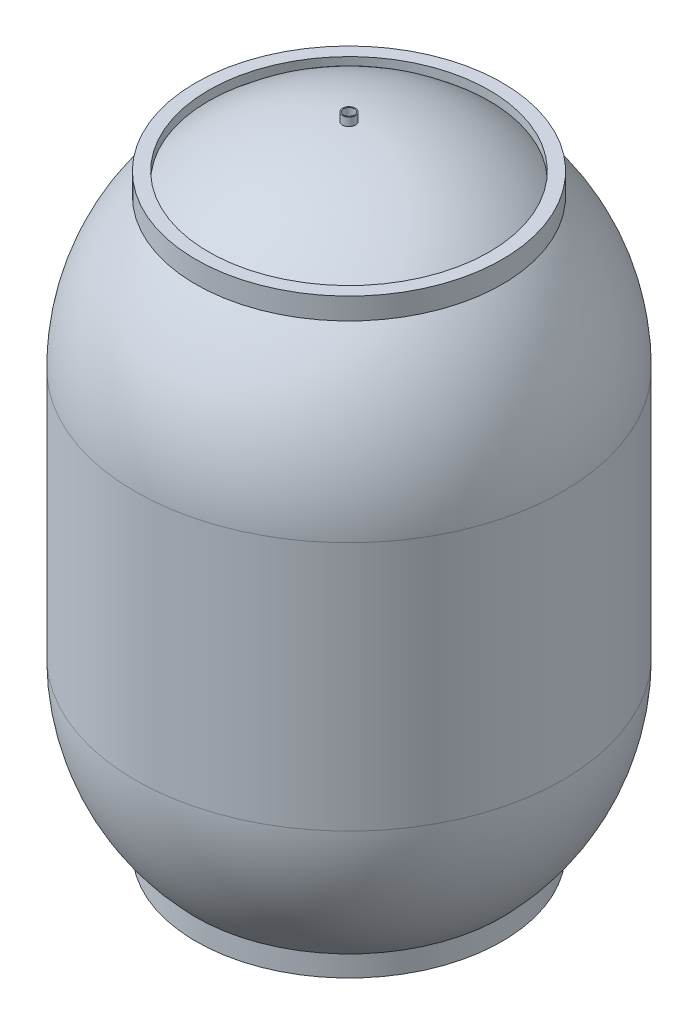
ISO-10303-21;
HEADER;
FILE_DESCRIPTION(('STEP AP214'),'2;1');
FILE_NAME('part.step','',(''),(''),'','','');
FILE_SCHEMA(('AUTOMOTIVE_DESIGN { 1 0 10303 214 1 1 1 1 }'));
ENDSEC;
DATA;
#1=APPLICATION_CONTEXT('core data for automotive mechanical design processes');
#2=APPLICATION_PROTOCOL_DEFINITION('international standard','automotive_design',2000,#1);
#3=PRODUCT_CONTEXT('',#1,'mechanical');
#4=PRODUCT('Part','Part','',(#3));
#5=PRODUCT_RELATED_PRODUCT_CATEGORY('part','',(#4));
#6=PRODUCT_DEFINITION_FORMATION('','',#4);
#7=PRODUCT_DEFINITION_CONTEXT('part definition',#1,'design');
#8=PRODUCT_DEFINITION('design','',#6,#7);
#9=PRODUCT_DEFINITION_SHAPE('','',#8);
#10=(LENGTH_UNIT() NAMED_UNIT(*) SI_UNIT(.MILLI.,.METRE.));
#11=(NAMED_UNIT(*) PLANE_ANGLE_UNIT() SI_UNIT($,.RADIAN.));
#12=(NAMED_UNIT(*) SI_UNIT($,.STERADIAN.) SOLID_ANGLE_UNIT());
#13=UNCERTAINTY_MEASURE_WITH_UNIT(LENGTH_MEASURE(1.E-05),#10,'distance_accuracy_value','');
#14=(GEOMETRIC_REPRESENTATION_CONTEXT(3) GLOBAL_UNCERTAINTY_ASSIGNED_CONTEXT((#13)) GLOBAL_UNIT_ASSIGNED_CONTEXT((#10,
#11,#12)) REPRESENTATION_CONTEXT('',''));
#15=CARTESIAN_POINT('',(0.,0.,0.));
#16=DIRECTION('',(0.,0.,1.));
#17=DIRECTION('',(1.,0.,0.));
#18=AXIS2_PLACEMENT_3D('',#15,#16,#17);
#19=CARTESIAN_POINT('',(0.,-3141.3,0.));
#20=DIRECTION('',(0.,1.,0.));
#21=DIRECTION('',(0.,0.,1.));
#22=AXIS2_PLACEMENT_3D('',#19,#20,#21);
#23=CYLINDRICAL_SURFACE('',#22,30.);
#24=CARTESIAN_POINT('',(0.,-0.45464985176169,0.));
#25=DIRECTION('',(0.,-1.,0.));
#26=DIRECTION('',(0.,0.,-1.));
#27=AXIS2_PLACEMENT_3D('',#24,#25,#26);
#28=CIRCLE('',#27,30.);
#29=CARTESIAN_POINT('',(0.,-0.45464985176169,-30.));
#30=VERTEX_POINT('',#29);
#31=EDGE_CURVE('E84',#30,#30,#28,.T.);
#32=ORIENTED_EDGE('',*,*,#31,.T.);
#33=EDGE_LOOP('',(#32));
#34=FACE_BOUND('',#33,.T.);
#35=CARTESIAN_POINT('',(0.,0.,0.));
#36=DIRECTION('',(0.,1.,0.));
#37=DIRECTION('',(0.,0.,1.));
#38=AXIS2_PLACEMENT_3D('',#35,#36,#37);
#39=CIRCLE('',#38,30.);
#40=CARTESIAN_POINT('',(0.,0.,30.));
#41=VERTEX_POINT('',#40);
#42=EDGE_CURVE('E10',#41,#41,#39,.F.);
#43=ORIENTED_EDGE('',*,*,#42,.F.);
#44=EDGE_LOOP('',(#43));
#45=FACE_BOUND('',#44,.T.);
#46=ADVANCED_FACE('F39',(#34,#45),#23,.F.);
#47=CARTESIAN_POINT('',(-2.17534878999004E-11,-2939.07,0.));
#48=DIRECTION('',(0.,-1.,0.));
#49=DIRECTION('',(1.,0.,0.));
#50=AXIS2_PLACEMENT_3D('',#47,#48,#49);
#51=PLANE('',#50);
#52=CARTESIAN_POINT('',(3.47179437938087E-13,-2939.07,0.));
#53=DIRECTION('',(0.,1.,0.));
#54=DIRECTION('',(-1.,0.,0.));
#55=AXIS2_PLACEMENT_3D('',#52,#53,#54);
#56=CIRCLE('',#55,649.929573971954);
#57=CARTESIAN_POINT('',(-649.929573971953,-2939.07,0.));
#58=VERTEX_POINT('',#57);
#59=EDGE_CURVE('E55',#58,#58,#56,.T.);
#60=ORIENTED_EDGE('',*,*,#59,.T.);
#61=EDGE_LOOP('',(#60));
#62=FACE_BOUND('',#61,.T.);
#63=CARTESIAN_POINT('',(3.47179437938087E-13,-2939.07,0.));
#64=DIRECTION('',(0.,1.,0.));
#65=DIRECTION('',(-1.,0.,0.));
#66=AXIS2_PLACEMENT_3D('',#63,#64,#65);
#67=CIRCLE('',#66,709.929573971954);
#68=CARTESIAN_POINT('',(-709.929573971953,-2939.07,0.));
#69=VERTEX_POINT('',#68);
#70=EDGE_CURVE('E72',#69,#69,#67,.T.);
#71=ORIENTED_EDGE('',*,*,#70,.F.);
#72=EDGE_LOOP('',(#71));
#73=FACE_BOUND('',#72,.T.);
#74=ADVANCED_FACE('F111',(#62,#73),#51,.T.);
#75=CARTESIAN_POINT('',(0.,0.,0.));
#76=DIRECTION('',(0.,1.,0.));
#77=DIRECTION('',(-1.,0.,0.));
#78=AXIS2_PLACEMENT_3D('',#75,#76,#77);
#79=CYLINDRICAL_SURFACE('',#78,649.929573971954);
#80=CARTESIAN_POINT('',(3.42423846928602E-13,-2898.81123654541,0.));
#81=DIRECTION('',(0.,1.,0.));
#82=DIRECTION('',(-1.,0.,0.));
#83=AXIS2_PLACEMENT_3D('',#80,#81,#82);
#84=CIRCLE('',#83,649.929573971954);
#85=CARTESIAN_POINT('',(649.929573971954,-2898.81123654541,0.));
#86=VERTEX_POINT('',#85);
#87=EDGE_CURVE('E50',#86,#86,#84,.T.);
#88=ORIENTED_EDGE('',*,*,#87,.T.);
#89=EDGE_LOOP('',(#88));
#90=FACE_BOUND('',#89,.T.);
#91=ORIENTED_EDGE('',*,*,#59,.F.);
#92=EDGE_LOOP('',(#91));
#93=FACE_BOUND('',#92,.T.);
#94=ADVANCED_FACE('F114',(#90,#93),#79,.F.);
#95=CARTESIAN_POINT('',(0.,0.,0.));
#96=DIRECTION('',(0.,1.,0.));
#97=DIRECTION('',(-1.,0.,0.));
#98=AXIS2_PLACEMENT_3D('',#95,#96,#97);
#99=CYLINDRICAL_SURFACE('',#98,709.929573971954);
#100=ORIENTED_EDGE('',*,*,#70,.T.);
#101=EDGE_LOOP('',(#100));
#102=FACE_BOUND('',#101,.T.);
#103=CARTESIAN_POINT('',(3.35744378948675E-13,-2842.26576809153,0.));
#104=DIRECTION('',(0.,1.,0.));
#105=DIRECTION('',(-1.,0.,0.));
#106=AXIS2_PLACEMENT_3D('',#103,#104,#105);
#107=CIRCLE('',#106,709.929573971954);
#108=CARTESIAN_POINT('',(-709.929573971953,-2842.26576809153,0.));
#109=VERTEX_POINT('',#108);
#110=EDGE_CURVE('E46',#109,#109,#107,.T.);
#111=ORIENTED_EDGE('',*,*,#110,.F.);
#112=EDGE_LOOP('',(#111));
#113=FACE_BOUND('',#112,.T.);
#114=ADVANCED_FACE('F116',(#102,#113),#99,.T.);
#115=CARTESIAN_POINT('',(2.77555756156289E-13,-2149.07,0.));
#116=DIRECTION('',(0.,1.,0.));
#117=DIRECTION('',(1.,0.,0.));
#118=AXIS2_PLACEMENT_3D('',#115,#116,#117);
#119=SPHERICAL_SURFACE('',#118,992.23);
#120=CARTESIAN_POINT('',(0.,-3140.84637242475,0.));
#121=DIRECTION('',(0.,1.,0.));
#122=DIRECTION('',(0.,0.,1.));
#123=AXIS2_PLACEMENT_3D('',#120,#121,#122);
#124=CIRCLE('',#123,30.);
#125=CARTESIAN_POINT('',(29.9999999999962,-3140.84637242475,0.));
#126=VERTEX_POINT('',#125);
#127=EDGE_CURVE('E77',#126,#126,#124,.F.);
#128=CARTESIAN_POINT('',(29.9999999999962,-3140.84637242475,0.));
#129=CARTESIAN_POINT('',(37.0660800715071,-3140.63264470113,0.));
#130=CARTESIAN_POINT('',(44.1298747069167,-3140.34337743555,0.));
#131=CARTESIAN_POINT('',(58.249668954205,-3139.61395033201,0.));
#132=CARTESIAN_POINT('',(65.3056685660836,-3139.17379049403,0.));
#133=CARTESIAN_POINT('',(79.4066486149817,-3138.14276475719,0.));
#134=CARTESIAN_POINT('',(86.4516290520012,-3137.55189885831,0.));
#135=CARTESIAN_POINT('',(100.527352587922,-3136.21973482872,0.));
#136=CARTESIAN_POINT('',(107.558095686823,-3135.47843669801,0.));
#137=CARTESIAN_POINT('',(121.602132631634,-3133.84574580677,0.));
#138=CARTESIAN_POINT('',(128.615426477545,-3132.95435304625,0.));
#139=CARTESIAN_POINT('',(142.621361041368,-3131.02188039142,0.));
#140=CARTESIAN_POINT('',(149.614001759282,-3129.98080049711,0.));
#141=CARTESIAN_POINT('',(163.575435608734,-3127.7494290971,0.));
#142=CARTESIAN_POINT('',(170.544228740273,-3126.5591375914,0.));
#143=CARTESIAN_POINT('',(184.454783857836,-3124.02988675069,0.));
#144=CARTESIAN_POINT('',(191.396545843859,-3122.69092741568,0.));
#145=CARTESIAN_POINT('',(205.249867458591,-3119.86495258898,0.));
#146=CARTESIAN_POINT('',(212.161427087301,-3118.3779370973,0.));
#147=CARTESIAN_POINT('',(225.951186573332,-3115.25652927336,0.));
#148=CARTESIAN_POINT('',(232.829386430654,-3113.6221369411,0.));
#149=CARTESIAN_POINT('',(246.549284199518,-3110.20672207658,0.));
#150=CARTESIAN_POINT('',(253.390982111059,-3108.42569954432,0.));
#151=CARTESIAN_POINT('',(267.034750489211,-3104.71783790606,0.));
#152=CARTESIAN_POINT('',(273.836820955822,-3102.79099880006,0.));
#153=CARTESIAN_POINT('',(287.398227047997,-3098.79238425397,0.));
#154=CARTESIAN_POINT('',(294.157562673562,-3096.72060881388,0.));
#155=CARTESIAN_POINT('',(307.630411210129,-3092.43306805072,0.));
#156=CARTESIAN_POINT('',(314.343924121131,-3090.21730272763,0.));
#157=CARTESIAN_POINT('',(327.72206028829,-3085.64279442859,0.));
#158=CARTESIAN_POINT('',(334.386683544446,-3083.28405145262,0.));
#159=CARTESIAN_POINT('',(347.663995795935,-3078.42466539453,0.));
#160=CARTESIAN_POINT('',(354.276684791267,-3075.9240223124,0.));
#161=CARTESIAN_POINT('',(367.447107640305,-3070.78197841308,0.));
#162=CARTESIAN_POINT('',(374.004841494012,-3068.14057759587,0.));
#163=CARTESIAN_POINT('',(387.062358284206,-3062.71822489996,0.));
#164=CARTESIAN_POINT('',(393.562141220693,-3059.93727302124,0.));
#165=CARTESIAN_POINT('',(406.500786874624,-3054.23708862711,0.));
#166=CARTESIAN_POINT('',(412.939649592069,-3051.3178561117,0.));
#167=CARTESIAN_POINT('',(425.753513336334,-3045.34244403984,0.));
#168=CARTESIAN_POINT('',(432.128514363154,-3042.28626448339,0.));
#169=CARTESIAN_POINT('',(444.811742428577,-3036.0383544868,0.));
#170=CARTESIAN_POINT('',(451.11996946718,-3032.84662404665,0.));
#171=CARTESIAN_POINT('',(463.66676776302,-3026.32907036381,0.));
#172=CARTESIAN_POINT('',(469.905339020258,-3023.00324712113,0.));
#173=CARTESIAN_POINT('',(482.309975781051,-3016.21902717204,0.));
#174=CARTESIAN_POINT('',(488.476041284606,-3012.76063046563,0.));
#175=CARTESIAN_POINT('',(500.732849688901,-3005.71284349195,0.));
#176=CARTESIAN_POINT('',(506.82359258964,-3002.12345322468,0.));
#177=CARTESIAN_POINT('',(518.926973347693,-2994.81531887261,0.));
#178=CARTESIAN_POINT('',(524.939611205006,-2991.09657478781,0.));
#179=CARTESIAN_POINT('',(536.884035120766,-2983.53143164213,0.));
#180=CARTESIAN_POINT('',(542.815821179214,-2979.68503258125,0.));
#181=CARTESIAN_POINT('',(554.595831661087,-2971.86633662193,0.));
#182=CARTESIAN_POINT('',(560.444056084513,-2967.89403972348,0.));
#183=CARTESIAN_POINT('',(572.054271694624,-2959.82536281493,0.));
#184=CARTESIAN_POINT('',(577.816262881308,-2955.72898280483,0.));
#185=CARTESIAN_POINT('',(589.251379582961,-2947.4140108101,0.));
#186=CARTESIAN_POINT('',(594.92450509793,-2943.19541882547,0.));
#187=CARTESIAN_POINT('',(606.179299465911,-2934.63795087077,0.));
#188=CARTESIAN_POINT('',(611.760968318924,-2930.29907490069,0.));
#189=CARTESIAN_POINT('',(622.830296987663,-2921.50301810045,0.));
#190=CARTESIAN_POINT('',(628.317956803389,-2917.0458372703,0.));
#191=CARTESIAN_POINT('',(639.196769781596,-2908.01521815142,0.));
#192=CARTESIAN_POINT('',(644.587922944076,-2903.44177986269,0.));
#193=CARTESIAN_POINT('',(649.929573971954,-2898.81123654541,0.));
#194=B_SPLINE_CURVE_WITH_KNOTS('',3,(#128,#129,#130,#131,#132,#133,#134,#135,#136,#137,#138,
#139,#140,#141,#142,#143,#144,#145,#146,#147,#148,#149,#150,#151,#152,#153,#154,#155,#156,#157,
#158,#159,#160,#161,#162,#163,#164,#165,#166,#167,#168,#169,#170,#171,#172,#173,#174,#175,#176,
#177,#178,#179,#180,#181,#182,#183,#184,#185,#186,#187,#188,#189,#190,#191,#192,#193),
.UNSPECIFIED.,.F.,.F.,(4,2,2,2,2,2,2,2,2,2,2,2,2,2,2,2,2,2,2,2,2,2,2,2,2,2,2,2,2,2,2,2,4),(0.,
21.2075304631037,42.4150609262073,63.622591389311,84.8301218524147,106.037652315518,
127.245182778622,148.452713241725,169.660243704829,190.867774167933,212.075304631036,
233.28283509414,254.490365557244,275.697896020347,296.905426483451,318.112956946555,
339.320487409658,360.528017872762,381.735548335866,402.943078798969,424.150609262073,
445.358139725177,466.56567018828,487.773200651384,508.980731114488,530.188261577591,
551.395792040695,572.603322503799,593.810852966902,615.018383430006,636.225913893109,
657.433444356213,678.640974819317),.UNSPECIFIED.);
#195=EDGE_CURVE('BSEAM123',#126,#86,#194,.T.);
#196=ORIENTED_EDGE('',*,*,#127,.F.);
#197=ORIENTED_EDGE('',*,*,#87,.F.);
#198=ORIENTED_EDGE('',*,*,#195,.T.);
#199=ORIENTED_EDGE('',*,*,#195,.F.);
#200=EDGE_LOOP('',(#196,#198,#197,#199));
#201=FACE_BOUND('',#200,.T.);
#202=ADVANCED_FACE('F123',(#201),#119,.T.);
#203=CARTESIAN_POINT('',(1.21430643318376E-13,-990.,0.));
#204=DIRECTION('',(0.,1.,0.));
#205=DIRECTION('',(-1.,0.,0.));
#206=AXIS2_PLACEMENT_3D('',#203,#204,#205);
#207=SPHERICAL_SURFACE('',#206,992.23);
#208=CARTESIAN_POINT('',(0.,1.77637242475159,0.));
#209=DIRECTION('',(0.,-1.,0.));
#210=DIRECTION('',(0.,0.,-1.));
#211=AXIS2_PLACEMENT_3D('',#208,#209,#210);
#212=CIRCLE('',#211,30.);
#213=CARTESIAN_POINT('',(-30.0000000000028,1.7763724247517,0.));
#214=VERTEX_POINT('',#213);
#215=EDGE_CURVE('E91',#214,#214,#212,.F.);
#216=CARTESIAN_POINT('',(0.,-241.07615309421,0.));
#217=DIRECTION('',(0.,1.,0.));
#218=DIRECTION('',(-1.,0.,0.));
#219=AXIS2_PLACEMENT_3D('',#216,#217,#218);
#220=CIRCLE('',#219,650.871296368056);
#221=CARTESIAN_POINT('',(-650.871296368055,-241.07615309421,0.));
#222=VERTEX_POINT('',#221);
#223=EDGE_CURVE('E69',#222,#222,#220,.T.);
#224=CARTESIAN_POINT('',(-30.0000000000028,1.7763724247517,0.));
#225=CARTESIAN_POINT('',(-37.0790635464691,1.562252058539,0.));
#226=CARTESIAN_POINT('',(-44.155833245174,1.2723142074529,0.));
#227=CARTESIAN_POINT('',(-58.3015430002631,0.540991241095167,0.));
#228=CARTESIAN_POINT('',(-65.3704830566473,0.0996061258235217,0.));
#229=CARTESIAN_POINT('',(-79.4972915802972,-0.934423663344088,0.));
#230=CARTESIAN_POINT('',(-86.5551600475629,-1.52706833724005,0.));
#231=CARTESIAN_POINT('',(-100.656589484557,-2.86334157743072,0.));
#232=CARTESIAN_POINT('',(-107.700150454286,-3.60697014372544,0.));
#233=CARTESIAN_POINT('',(-121.769735290187,-5.24487126027031,0.));
#234=CARTESIAN_POINT('',(-128.79575915636,-6.13914381052047,0.));
#235=CARTESIAN_POINT('',(-142.82704828915,-8.07792257869581,0.));
#236=CARTESIAN_POINT('',(-149.832313555768,-9.122428796621,0.));
#237=CARTESIAN_POINT('',(-163.818873492998,-11.3611960579966,0.));
#238=CARTESIAN_POINT('',(-170.800168163609,-12.5554571014471,0.));
#239=CARTESIAN_POINT('',(-184.735585908117,-15.0931864115477,0.));
#240=CARTESIAN_POINT('',(-191.689708982014,-16.436654678198,0.));
#241=CARTESIAN_POINT('',(-205.567594989537,-19.27218244489,0.));
#242=CARTESIAN_POINT('',(-212.491357923164,-20.7642419449317,0.));
#243=CARTESIAN_POINT('',(-226.305349027412,-23.8962680509684,0.));
#244=CARTESIAN_POINT('',(-233.195577198034,-25.5362346569633,0.));
#245=CARTESIAN_POINT('',(-246.939339529508,-28.9633230322498,0.));
#246=CARTESIAN_POINT('',(-253.792873690359,-30.7504448015412,0.));
#247=CARTESIAN_POINT('',(-267.460105580164,-34.4710240879797,0.));
#248=CARTESIAN_POINT('',(-274.273803309118,-36.4044816051267,0.));
#249=CARTESIAN_POINT('',(-287.858238178445,-40.4168458753894,0.));
#250=CARTESIAN_POINT('',(-294.628975318819,-42.4957526285051,0.));
#251=CARTESIAN_POINT('',(-308.124384552214,-46.79806216868,0.));
#252=CARTESIAN_POINT('',(-314.849056645237,-49.0214649557392,0.));
#253=CARTESIAN_POINT('',(-328.249252446499,-53.6117471087361,0.));
#254=CARTESIAN_POINT('',(-334.92477615474,-55.9786264746739,0.));
#255=CARTESIAN_POINT('',(-348.223614384091,-60.8547765447433,0.));
#256=CARTESIAN_POINT('',(-354.846928905203,-63.364047248875,0.));
#257=CARTESIAN_POINT('',(-368.038311896447,-68.5238294666255,0.));
#258=CARTESIAN_POINT('',(-374.60638036658,-71.1743409802443,0.));
#259=CARTESIAN_POINT('',(-387.68425972295,-76.6153895277699,0.));
#260=CARTESIAN_POINT('',(-394.194070609187,-79.4059265616768,0.));
#261=CARTESIAN_POINT('',(-407.152449976603,-85.1257466573113,0.));
#262=CARTESIAN_POINT('',(-413.601018457782,-88.0550297190389,0.));
#263=CARTESIAN_POINT('',(-426.433956274248,-94.0509987612392,0.));
#264=CARTESIAN_POINT('',(-432.818325609535,-97.1176847417119,0.));
#265=CARTESIAN_POINT('',(-445.519937829406,-103.387053511557,0.));
#266=CARTESIAN_POINT('',(-451.837180713989,-106.58973630093,0.));
#267=CARTESIAN_POINT('',(-464.401643505892,-113.129630222644,0.));
#268=CARTESIAN_POINT('',(-470.648863413211,-116.466841354985,0.));
#269=CARTESIAN_POINT('',(-483.07041583026,-123.274261814054,0.));
#270=CARTESIAN_POINT('',(-489.244748339989,-126.744471140783,0.));
#271=CARTESIAN_POINT('',(-501.517694961534,-133.816296858506,0.));
#272=CARTESIAN_POINT('',(-507.616309073351,-137.4179132495,0.));
#273=CARTESIAN_POINT('',(-519.735022615302,-144.750901715442,0.));
#274=CARTESIAN_POINT('',(-525.755122045436,-148.482273790389,0.));
#275=CARTESIAN_POINT('',(-537.714045944521,-156.073062744192,0.));
#276=CARTESIAN_POINT('',(-543.652870413472,-159.932479623048,0.));
#277=CARTESIAN_POINT('',(-555.446521359712,-167.777588614425,0.));
#278=CARTESIAN_POINT('',(-561.301347837,-171.763280726947,0.));
#279=CARTESIAN_POINT('',(-572.924318344883,-179.859112642986,0.));
#280=CARTESIAN_POINT('',(-578.692462375479,-183.969252446504,0.));
#281=CARTESIAN_POINT('',(-590.139423050552,-192.312095416711,0.));
#282=CARTESIAN_POINT('',(-595.818239695029,-196.544798583401,0.));
#283=CARTESIAN_POINT('',(-607.083942471691,-205.130826727245,0.));
#284=CARTESIAN_POINT('',(-612.670828603877,-209.484151704398,0.));
#285=CARTESIAN_POINT('',(-623.750106187632,-218.309430447354,0.));
#286=CARTESIAN_POINT('',(-629.242497639201,-222.781384213155,0.));
#287=CARTESIAN_POINT('',(-640.130276937907,-231.841858797801,0.));
#288=CARTESIAN_POINT('',(-645.525664785044,-236.430379616646,0.));
#289=CARTESIAN_POINT('',(-650.871296368055,-241.07615309421,0.));
#290=B_SPLINE_CURVE_WITH_KNOTS('',3,(#224,#225,#226,#227,#228,#229,#230,#231,#232,#233,#234,
#235,#236,#237,#238,#239,#240,#241,#242,#243,#244,#245,#246,#247,#248,#249,#250,#251,#252,#253,
#254,#255,#256,#257,#258,#259,#260,#261,#262,#263,#264,#265,#266,#267,#268,#269,#270,#271,#272,
#273,#274,#275,#276,#277,#278,#279,#280,#281,#282,#283,#284,#285,#286,#287,#288,#289),
.UNSPECIFIED.,.F.,.F.,(4,2,2,2,2,2,2,2,2,2,2,2,2,2,2,2,2,2,2,2,2,2,2,2,2,2,2,2,2,2,2,2,4),(0.,
21.2464964586853,42.4929929173708,63.7394893760561,84.9859858347416,106.232482293427,
127.478978752112,148.725475210798,169.971971669483,191.218468128169,212.464964586854,
233.711461045539,254.957957504225,276.20445396291,297.450950421596,318.697446880281,
339.943943338966,361.190439797652,382.436936256337,403.683432715022,424.929929173708,
446.176425632393,467.422922091079,488.669418549764,509.915915008449,531.162411467135,
552.40890792582,573.655404384506,594.901900843191,616.148397301876,637.394893760562,
658.641390219247,679.887886677933),.UNSPECIFIED.);
#291=EDGE_CURVE('BSEAM170',#214,#222,#290,.T.);
#292=ORIENTED_EDGE('',*,*,#215,.F.);
#293=ORIENTED_EDGE('',*,*,#223,.T.);
#294=ORIENTED_EDGE('',*,*,#291,.T.);
#295=ORIENTED_EDGE('',*,*,#291,.F.);
#296=EDGE_LOOP('',(#292,#294,#293,#295));
#297=FACE_BOUND('',#296,.T.);
#298=ADVANCED_FACE('F170',(#297),#207,.T.);
#299=CARTESIAN_POINT('',(0.,0.,0.));
#300=DIRECTION('',(0.,1.,0.));
#301=DIRECTION('',(-1.,0.,0.));
#302=AXIS2_PLACEMENT_3D('',#299,#300,#301);
#303=CYLINDRICAL_SURFACE('',#302,650.871296368056);
#304=ORIENTED_EDGE('',*,*,#223,.F.);
#305=EDGE_LOOP('',(#304));
#306=FACE_BOUND('',#305,.T.);
#307=CARTESIAN_POINT('',(0.,-197.77,0.));
#308=DIRECTION('',(0.,1.,0.));
#309=DIRECTION('',(-1.,0.,0.));
#310=AXIS2_PLACEMENT_3D('',#307,#308,#309);
#311=CIRCLE('',#310,650.871296368056);
#312=CARTESIAN_POINT('',(-650.871296368056,-197.77,0.));
#313=VERTEX_POINT('',#312);
#314=EDGE_CURVE('E59',#313,#313,#311,.T.);
#315=ORIENTED_EDGE('',*,*,#314,.T.);
#316=EDGE_LOOP('',(#315));
#317=FACE_BOUND('',#316,.T.);
#318=ADVANCED_FACE('F177',(#306,#317),#303,.F.);
#319=CARTESIAN_POINT('',(0.,-197.77,0.));
#320=DIRECTION('',(0.,-1.,0.));
#321=DIRECTION('',(1.,0.,0.));
#322=AXIS2_PLACEMENT_3D('',#319,#320,#321);
#323=PLANE('',#322);
#324=ORIENTED_EDGE('',*,*,#314,.F.);
#325=EDGE_LOOP('',(#324));
#326=FACE_BOUND('',#325,.T.);
#327=CARTESIAN_POINT('',(0.,-197.77,0.));
#328=DIRECTION('',(0.,1.,0.));
#329=DIRECTION('',(-1.,0.,0.));
#330=AXIS2_PLACEMENT_3D('',#327,#328,#329);
#331=CIRCLE('',#330,710.871296368056);
#332=CARTESIAN_POINT('',(-710.871296368056,-197.77,0.));
#333=VERTEX_POINT('',#332);
#334=EDGE_CURVE('E62',#333,#333,#331,.T.);
#335=ORIENTED_EDGE('',*,*,#334,.T.);
#336=EDGE_LOOP('',(#335));
#337=FACE_BOUND('',#336,.T.);
#338=ADVANCED_FACE('F145',(#326,#337),#323,.F.);
#339=CARTESIAN_POINT('',(0.,0.,0.));
#340=DIRECTION('',(0.,1.,0.));
#341=DIRECTION('',(-1.,0.,0.));
#342=AXIS2_PLACEMENT_3D('',#339,#340,#341);
#343=CYLINDRICAL_SURFACE('',#342,710.871296368056);
#344=ORIENTED_EDGE('',*,*,#334,.F.);
#345=EDGE_LOOP('',(#344));
#346=FACE_BOUND('',#345,.T.);
#347=CARTESIAN_POINT('',(0.,-297.77,0.));
#348=DIRECTION('',(0.,1.,0.));
#349=DIRECTION('',(-1.,0.,0.));
#350=AXIS2_PLACEMENT_3D('',#347,#348,#349);
#351=CIRCLE('',#350,710.871296368056);
#352=CARTESIAN_POINT('',(-710.871296368056,-297.77,0.));
#353=VERTEX_POINT('',#352);
#354=EDGE_CURVE('E66',#353,#353,#351,.T.);
#355=ORIENTED_EDGE('',*,*,#354,.T.);
#356=EDGE_LOOP('',(#355));
#357=FACE_BOUND('',#356,.T.);
#358=ADVANCED_FACE('F234',(#346,#357),#343,.T.);
#359=CARTESIAN_POINT('',(1.1694435435655E-13,-990.,0.));
#360=DIRECTION('',(0.,1.,0.));
#361=DIRECTION('',(-1.,0.,0.));
#362=AXIS2_PLACEMENT_3D('',#359,#360,#361);
#363=CIRCLE('',#362,992.23);
#364=CARTESIAN_POINT('',(-992.23,-990.,0.));
#365=VERTEX_POINT('',#364);
#366=EDGE_CURVE('E73',#365,#365,#363,.T.);
#367=ORIENTED_EDGE('',*,*,#366,.T.);
#368=EDGE_LOOP('',(#367));
#369=FACE_BOUND('',#368,.T.);
#370=ORIENTED_EDGE('',*,*,#354,.F.);
#371=EDGE_LOOP('',(#370));
#372=FACE_BOUND('',#371,.T.);
#373=ADVANCED_FACE('F179',(#369,#372),#207,.T.);
#374=CARTESIAN_POINT('',(0.,0.,0.));
#375=DIRECTION('',(0.,1.,0.));
#376=DIRECTION('',(-1.,0.,0.));
#377=AXIS2_PLACEMENT_3D('',#374,#375,#376);
#378=CYLINDRICAL_SURFACE('',#377,992.23);
#379=CARTESIAN_POINT('',(2.53860205673769E-13,-2149.07,0.));
#380=DIRECTION('',(0.,1.,0.));
#381=DIRECTION('',(-1.,0.,0.));
#382=AXIS2_PLACEMENT_3D('',#379,#380,#381);
#383=CIRCLE('',#382,992.23);
#384=CARTESIAN_POINT('',(-992.23,-2149.07,0.));
#385=VERTEX_POINT('',#384);
#386=EDGE_CURVE('E63',#385,#385,#383,.T.);
#387=ORIENTED_EDGE('',*,*,#386,.T.);
#388=EDGE_LOOP('',(#387));
#389=FACE_BOUND('',#388,.T.);
#390=ORIENTED_EDGE('',*,*,#366,.F.);
#391=EDGE_LOOP('',(#390));
#392=FACE_BOUND('',#391,.T.);
#393=ADVANCED_FACE('F41',(#389,#392),#378,.T.);
#394=ORIENTED_EDGE('',*,*,#110,.T.);
#395=EDGE_LOOP('',(#394));
#396=FACE_BOUND('',#395,.T.);
#397=ORIENTED_EDGE('',*,*,#386,.F.);
#398=EDGE_LOOP('',(#397));
#399=FACE_BOUND('',#398,.T.);
#400=ADVANCED_FACE('F136',(#396,#399),#119,.T.);
#401=CARTESIAN_POINT('',(3.75529584448766E-13,-3139.07,0.));
#402=DIRECTION('',(0.,1.,0.));
#403=DIRECTION('',(0.,0.,1.));
#404=AXIS2_PLACEMENT_3D('',#401,#402,#403);
#405=CIRCLE('',#404,30.);
#406=CARTESIAN_POINT('',(3.75529584448766E-13,-3139.07,30.));
#407=VERTEX_POINT('',#406);
#408=EDGE_CURVE('E149',#407,#407,#405,.T.);
#409=ORIENTED_EDGE('',*,*,#408,.F.);
#410=EDGE_LOOP('',(#409));
#411=FACE_BOUND('',#410,.T.);
#412=CARTESIAN_POINT('',(0.,-3138.61535014824,0.));
#413=DIRECTION('',(0.,1.,0.));
#414=DIRECTION('',(0.,0.,1.));
#415=AXIS2_PLACEMENT_3D('',#412,#413,#414);
#416=CIRCLE('',#415,30.);
#417=CARTESIAN_POINT('',(0.,-3138.61535014824,30.));
#418=VERTEX_POINT('',#417);
#419=EDGE_CURVE('E86',#418,#418,#416,.F.);
#420=ORIENTED_EDGE('',*,*,#419,.F.);
#421=EDGE_LOOP('',(#420));
#422=FACE_BOUND('',#421,.T.);
#423=ADVANCED_FACE('F129',(#411,#422),#23,.F.);
#424=CARTESIAN_POINT('',(2.77555756156289E-13,-2149.07,0.));
#425=DIRECTION('',(0.,1.,0.));
#426=DIRECTION('',(1.,0.,0.));
#427=AXIS2_PLACEMENT_3D('',#424,#425,#426);
#428=SPHERICAL_SURFACE('',#427,990.);
#429=ORIENTED_EDGE('',*,*,#419,.T.);
#430=EDGE_LOOP('',(#429));
#431=FACE_BOUND('',#430,.T.);
#432=CARTESIAN_POINT('',(2.53860205673769E-13,-2149.07,0.));
#433=DIRECTION('',(0.,1.,0.));
#434=DIRECTION('',(-1.,0.,0.));
#435=AXIS2_PLACEMENT_3D('',#432,#433,#434);
#436=CIRCLE('',#435,990.);
#437=CARTESIAN_POINT('',(-990.,-2149.07,0.));
#438=VERTEX_POINT('',#437);
#439=EDGE_CURVE('E80',#438,#438,#436,.T.);
#440=ORIENTED_EDGE('',*,*,#439,.T.);
#441=EDGE_LOOP('',(#440));
#442=FACE_BOUND('',#441,.T.);
#443=ADVANCED_FACE('F135',(#431,#442),#428,.F.);
#444=CARTESIAN_POINT('',(0.,0.,0.));
#445=DIRECTION('',(0.,1.,0.));
#446=DIRECTION('',(-1.,0.,0.));
#447=AXIS2_PLACEMENT_3D('',#444,#445,#446);
#448=CYLINDRICAL_SURFACE('',#447,990.);
#449=ORIENTED_EDGE('',*,*,#439,.F.);
#450=EDGE_LOOP('',(#449));
#451=FACE_BOUND('',#450,.T.);
#452=CARTESIAN_POINT('',(1.1694435435655E-13,-990.,0.));
#453=DIRECTION('',(0.,1.,0.));
#454=DIRECTION('',(-1.,0.,0.));
#455=AXIS2_PLACEMENT_3D('',#452,#453,#454);
#456=CIRCLE('',#455,990.);
#457=CARTESIAN_POINT('',(-990.,-990.,0.));
#458=VERTEX_POINT('',#457);
#459=EDGE_CURVE('E76',#458,#458,#456,.T.);
#460=ORIENTED_EDGE('',*,*,#459,.T.);
#461=EDGE_LOOP('',(#460));
#462=FACE_BOUND('',#461,.T.);
#463=ADVANCED_FACE('F142',(#451,#462),#448,.F.);
#464=CARTESIAN_POINT('',(1.21430643318376E-13,-990.,0.));
#465=DIRECTION('',(0.,1.,0.));
#466=DIRECTION('',(1.,0.,0.));
#467=AXIS2_PLACEMENT_3D('',#464,#465,#466);
#468=SPHERICAL_SURFACE('',#467,990.);
#469=ORIENTED_EDGE('',*,*,#31,.F.);
#470=EDGE_LOOP('',(#469));
#471=FACE_BOUND('',#470,.T.);
#472=ORIENTED_EDGE('',*,*,#459,.F.);
#473=EDGE_LOOP('',(#472));
#474=FACE_BOUND('',#473,.T.);
#475=ADVANCED_FACE('F156',(#471,#474),#468,.F.);
#476=CARTESIAN_POINT('',(0.,40.,0.));
#477=DIRECTION('',(0.,1.,0.));
#478=DIRECTION('',(0.,0.,1.));
#479=AXIS2_PLACEMENT_3D('',#476,#477,#478);
#480=PLANE('',#479);
#481=CARTESIAN_POINT('',(0.,40.,0.));
#482=DIRECTION('',(0.,1.,0.));
#483=DIRECTION('',(0.,0.,1.));
#484=AXIS2_PLACEMENT_3D('',#481,#482,#483);
#485=CIRCLE('',#484,30.);
#486=CARTESIAN_POINT('',(0.,40.,30.));
#487=VERTEX_POINT('',#486);
#488=EDGE_CURVE('E87',#487,#487,#485,.T.);
#489=ORIENTED_EDGE('',*,*,#488,.T.);
#490=EDGE_LOOP('',(#489));
#491=FACE_BOUND('',#490,.T.);
#492=CARTESIAN_POINT('',(0.,40.,0.));
#493=DIRECTION('',(0.,1.,0.));
#494=DIRECTION('',(0.,0.,1.));
#495=AXIS2_PLACEMENT_3D('',#492,#493,#494);
#496=CIRCLE('',#495,25.);
#497=CARTESIAN_POINT('',(0.,40.,25.));
#498=VERTEX_POINT('',#497);
#499=EDGE_CURVE('E94',#498,#498,#496,.T.);
#500=ORIENTED_EDGE('',*,*,#499,.F.);
#501=EDGE_LOOP('',(#500));
#502=FACE_BOUND('',#501,.T.);
#503=ADVANCED_FACE('F161',(#491,#502),#480,.T.);
#504=CARTESIAN_POINT('',(0.,0.,0.));
#505=DIRECTION('',(0.,1.,0.));
#506=DIRECTION('',(0.,0.,1.));
#507=AXIS2_PLACEMENT_3D('',#504,#505,#506);
#508=PLANE('',#507);
#509=ORIENTED_EDGE('',*,*,#42,.T.);
#510=EDGE_LOOP('',(#509));
#511=FACE_BOUND('',#510,.T.);
#512=CARTESIAN_POINT('',(0.,0.,0.));
#513=DIRECTION('',(0.,1.,0.));
#514=DIRECTION('',(0.,0.,1.));
#515=AXIS2_PLACEMENT_3D('',#512,#513,#514);
#516=CIRCLE('',#515,25.);
#517=CARTESIAN_POINT('',(0.,0.,25.));
#518=VERTEX_POINT('',#517);
#519=EDGE_CURVE('E99',#518,#518,#516,.T.);
#520=ORIENTED_EDGE('',*,*,#519,.T.);
#521=EDGE_LOOP('',(#520));
#522=FACE_BOUND('',#521,.T.);
#523=ADVANCED_FACE('F167',(#511,#522),#508,.F.);
#524=CARTESIAN_POINT('',(0.,40.,0.));
#525=DIRECTION('',(0.,-1.,0.));
#526=DIRECTION('',(0.,0.,-1.));
#527=AXIS2_PLACEMENT_3D('',#524,#525,#526);
#528=CYLINDRICAL_SURFACE('',#527,30.);
#529=ORIENTED_EDGE('',*,*,#215,.T.);
#530=EDGE_LOOP('',(#529));
#531=FACE_BOUND('',#530,.T.);
#532=ORIENTED_EDGE('',*,*,#488,.F.);
#533=EDGE_LOOP('',(#532));
#534=FACE_BOUND('',#533,.T.);
#535=ADVANCED_FACE('F219',(#531,#534),#528,.T.);
#536=CARTESIAN_POINT('',(0.,40.,0.));
#537=DIRECTION('',(0.,-1.,0.));
#538=DIRECTION('',(0.,0.,-1.));
#539=AXIS2_PLACEMENT_3D('',#536,#537,#538);
#540=CYLINDRICAL_SURFACE('',#539,25.);
#541=ORIENTED_EDGE('',*,*,#499,.T.);
#542=EDGE_LOOP('',(#541));
#543=FACE_BOUND('',#542,.T.);
#544=ORIENTED_EDGE('',*,*,#519,.F.);
#545=EDGE_LOOP('',(#544));
#546=FACE_BOUND('',#545,.T.);
#547=ADVANCED_FACE('F214',(#543,#546),#540,.F.);
#548=CARTESIAN_POINT('',(3.75529584448766E-13,-3139.07,0.));
#549=DIRECTION('',(0.,1.,0.));
#550=DIRECTION('',(0.,0.,1.));
#551=AXIS2_PLACEMENT_3D('',#548,#549,#550);
#552=PLANE('',#551);
#553=ORIENTED_EDGE('',*,*,#408,.T.);
#554=EDGE_LOOP('',(#553));
#555=FACE_BOUND('',#554,.T.);
#556=CARTESIAN_POINT('',(3.75529584448766E-13,-3139.07,0.));
#557=DIRECTION('',(0.,1.,0.));
#558=DIRECTION('',(0.,0.,1.));
#559=AXIS2_PLACEMENT_3D('',#556,#557,#558);
#560=CIRCLE('',#559,25.);
#561=CARTESIAN_POINT('',(3.75529584448766E-13,-3139.07,25.));
#562=VERTEX_POINT('',#561);
#563=EDGE_CURVE('E194',#562,#562,#560,.T.);
#564=ORIENTED_EDGE('',*,*,#563,.F.);
#565=EDGE_LOOP('',(#564));
#566=FACE_BOUND('',#565,.T.);
#567=ADVANCED_FACE('F211',(#555,#566),#552,.T.);
#568=CARTESIAN_POINT('',(3.75529584448766E-13,-3179.07,0.));
#569=DIRECTION('',(0.,1.,0.));
#570=DIRECTION('',(0.,0.,1.));
#571=AXIS2_PLACEMENT_3D('',#568,#569,#570);
#572=PLANE('',#571);
#573=CARTESIAN_POINT('',(3.75529584448766E-13,-3179.07,0.));
#574=DIRECTION('',(0.,1.,0.));
#575=DIRECTION('',(0.,0.,1.));
#576=AXIS2_PLACEMENT_3D('',#573,#574,#575);
#577=CIRCLE('',#576,30.);
#578=CARTESIAN_POINT('',(3.75529584448766E-13,-3179.07,30.));
#579=VERTEX_POINT('',#578);
#580=EDGE_CURVE('E192',#579,#579,#577,.T.);
#581=ORIENTED_EDGE('',*,*,#580,.F.);
#582=EDGE_LOOP('',(#581));
#583=FACE_BOUND('',#582,.T.);
#584=CARTESIAN_POINT('',(3.75529584448766E-13,-3179.07,0.));
#585=DIRECTION('',(0.,1.,0.));
#586=DIRECTION('',(0.,0.,1.));
#587=AXIS2_PLACEMENT_3D('',#584,#585,#586);
#588=CIRCLE('',#587,25.);
#589=CARTESIAN_POINT('',(3.75529584448766E-13,-3179.07,25.));
#590=VERTEX_POINT('',#589);
#591=EDGE_CURVE('E198',#590,#590,#588,.T.);
#592=ORIENTED_EDGE('',*,*,#591,.T.);
#593=EDGE_LOOP('',(#592));
#594=FACE_BOUND('',#593,.T.);
#595=ADVANCED_FACE('F188',(#583,#594),#572,.F.);
#596=CARTESIAN_POINT('',(3.75529584448766E-13,-3139.07,0.));
#597=DIRECTION('',(0.,-1.,0.));
#598=DIRECTION('',(0.,0.,-1.));
#599=AXIS2_PLACEMENT_3D('',#596,#597,#598);
#600=CYLINDRICAL_SURFACE('',#599,30.);
#601=ORIENTED_EDGE('',*,*,#127,.T.);
#602=EDGE_LOOP('',(#601));
#603=FACE_BOUND('',#602,.T.);
#604=ORIENTED_EDGE('',*,*,#580,.T.);
#605=EDGE_LOOP('',(#604));
#606=FACE_BOUND('',#605,.T.);
#607=ADVANCED_FACE('F184',(#603,#606),#600,.T.);
#608=CARTESIAN_POINT('',(3.75529584448766E-13,-3139.07,0.));
#609=DIRECTION('',(0.,-1.,0.));
#610=DIRECTION('',(0.,0.,-1.));
#611=AXIS2_PLACEMENT_3D('',#608,#609,#610);
#612=CYLINDRICAL_SURFACE('',#611,25.);
#613=ORIENTED_EDGE('',*,*,#563,.T.);
#614=EDGE_LOOP('',(#613));
#615=FACE_BOUND('',#614,.T.);
#616=ORIENTED_EDGE('',*,*,#591,.F.);
#617=EDGE_LOOP('',(#616));
#618=FACE_BOUND('',#617,.T.);
#619=ADVANCED_FACE('F187',(#615,#618),#612,.F.);
#620=CLOSED_SHELL('',(#46,#74,#94,#114,#202,#298,#318,#338,#358,#373,#393,#400,#423,#443,#463,
#475,#503,#523,#535,#547,#567,#595,#607,#619));
#621=MANIFOLD_SOLID_BREP('B2',#620);
#622=ADVANCED_BREP_SHAPE_REPRESENTATION('',(#18,#621),#14);
#623=SHAPE_DEFINITION_REPRESENTATION(#9,#622);
ENDSEC;
END-ISO-10303-21;
